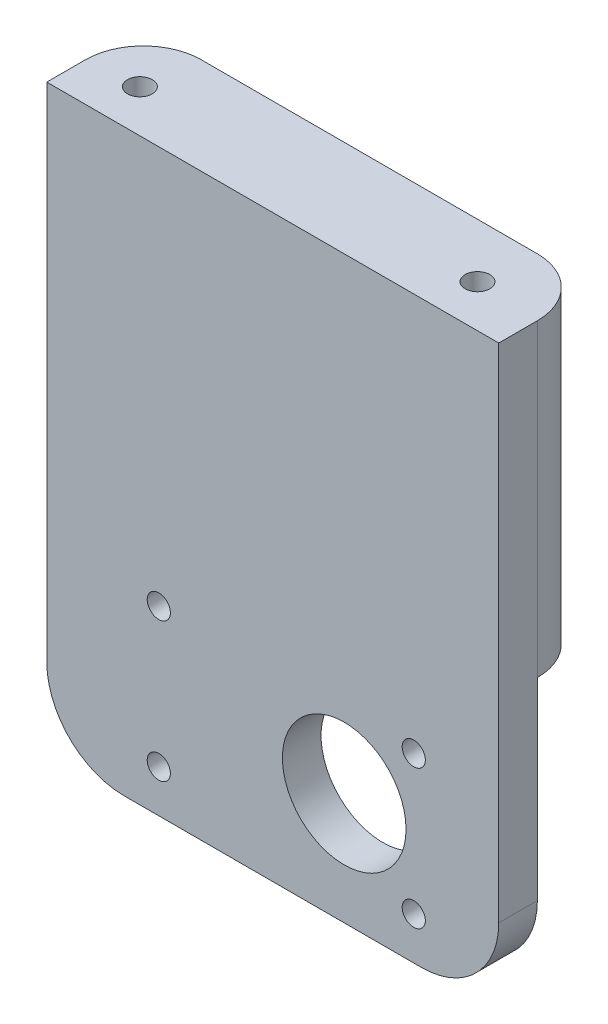
ISO-10303-21;
HEADER;
FILE_DESCRIPTION(('STEP AP214'),'2;1');
FILE_NAME('part.step','',(''),(''),'','','');
FILE_SCHEMA(('AUTOMOTIVE_DESIGN { 1 0 10303 214 1 1 1 1 }'));
ENDSEC;
DATA;
#1=APPLICATION_CONTEXT('core data for automotive mechanical design processes');
#2=APPLICATION_PROTOCOL_DEFINITION('international standard','automotive_design',2000,#1);
#3=PRODUCT_CONTEXT('',#1,'mechanical');
#4=PRODUCT('Part','Part','',(#3));
#5=PRODUCT_RELATED_PRODUCT_CATEGORY('part','',(#4));
#6=PRODUCT_DEFINITION_FORMATION('','',#4);
#7=PRODUCT_DEFINITION_CONTEXT('part definition',#1,'design');
#8=PRODUCT_DEFINITION('design','',#6,#7);
#9=PRODUCT_DEFINITION_SHAPE('','',#8);
#10=(LENGTH_UNIT() NAMED_UNIT(*) SI_UNIT(.MILLI.,.METRE.));
#11=(NAMED_UNIT(*) PLANE_ANGLE_UNIT() SI_UNIT($,.RADIAN.));
#12=(NAMED_UNIT(*) SI_UNIT($,.STERADIAN.) SOLID_ANGLE_UNIT());
#13=UNCERTAINTY_MEASURE_WITH_UNIT(LENGTH_MEASURE(1.E-05),#10,'distance_accuracy_value','');
#14=(GEOMETRIC_REPRESENTATION_CONTEXT(3) GLOBAL_UNCERTAINTY_ASSIGNED_CONTEXT((#13)) GLOBAL_UNIT_ASSIGNED_CONTEXT((#10,
#11,#12)) REPRESENTATION_CONTEXT('',''));
#15=CARTESIAN_POINT('',(0.,0.,0.));
#16=DIRECTION('',(0.,0.,1.));
#17=DIRECTION('',(1.,0.,0.));
#18=AXIS2_PLACEMENT_3D('',#15,#16,#17);
#19=CARTESIAN_POINT('',(0.,0.,-2.5));
#20=DIRECTION('',(0.,0.,1.));
#21=DIRECTION('',(1.,0.,0.));
#22=AXIS2_PLACEMENT_3D('',#19,#20,#21);
#23=PLANE('',#22);
#24=CARTESIAN_POINT('',(0.,0.,-2.5));
#25=DIRECTION('',(0.,0.,1.));
#26=DIRECTION('',(1.,0.,0.));
#27=AXIS2_PLACEMENT_3D('',#24,#25,#26);
#28=CIRCLE('',#27,8.);
#29=CARTESIAN_POINT('',(8.,0.,-2.5));
#30=VERTEX_POINT('',#29);
#31=EDGE_CURVE('E181',#30,#30,#28,.T.);
#32=ORIENTED_EDGE('',*,*,#31,.T.);
#33=EDGE_LOOP('',(#32));
#34=FACE_BOUND('',#33,.T.);
#35=CARTESIAN_POINT('',(-24.,-9.,-2.5));
#36=DIRECTION('',(0.,0.,1.));
#37=DIRECTION('',(1.,0.,0.));
#38=AXIS2_PLACEMENT_3D('',#35,#36,#37);
#39=CIRCLE('',#38,1.5);
#40=CARTESIAN_POINT('',(-22.5,-9.,-2.5));
#41=VERTEX_POINT('',#40);
#42=EDGE_CURVE('E178',#41,#41,#39,.T.);
#43=ORIENTED_EDGE('',*,*,#42,.T.);
#44=EDGE_LOOP('',(#43));
#45=FACE_BOUND('',#44,.T.);
#46=CARTESIAN_POINT('',(9.,-9.,-2.5));
#47=DIRECTION('',(0.,0.,1.));
#48=DIRECTION('',(1.,0.,0.));
#49=AXIS2_PLACEMENT_3D('',#46,#47,#48);
#50=CIRCLE('',#49,1.5);
#51=CARTESIAN_POINT('',(10.5,-9.,-2.5));
#52=VERTEX_POINT('',#51);
#53=EDGE_CURVE('E175',#52,#52,#50,.T.);
#54=ORIENTED_EDGE('',*,*,#53,.T.);
#55=EDGE_LOOP('',(#54));
#56=FACE_BOUND('',#55,.T.);
#57=CARTESIAN_POINT('',(9.,9.,-2.5));
#58=DIRECTION('',(0.,0.,1.));
#59=DIRECTION('',(1.,0.,0.));
#60=AXIS2_PLACEMENT_3D('',#57,#58,#59);
#61=CIRCLE('',#60,1.5);
#62=CARTESIAN_POINT('',(10.5,9.,-2.5));
#63=VERTEX_POINT('',#62);
#64=EDGE_CURVE('E172',#63,#63,#61,.T.);
#65=ORIENTED_EDGE('',*,*,#64,.T.);
#66=EDGE_LOOP('',(#65));
#67=FACE_BOUND('',#66,.T.);
#68=CARTESIAN_POINT('',(-24.,9.,-2.5));
#69=DIRECTION('',(0.,0.,1.));
#70=DIRECTION('',(1.,0.,0.));
#71=AXIS2_PLACEMENT_3D('',#68,#69,#70);
#72=CIRCLE('',#71,1.5);
#73=CARTESIAN_POINT('',(-22.5,9.,-2.5));
#74=VERTEX_POINT('',#73);
#75=EDGE_CURVE('E138',#74,#74,#72,.T.);
#76=ORIENTED_EDGE('',*,*,#75,.T.);
#77=EDGE_LOOP('',(#76));
#78=FACE_BOUND('',#77,.T.);
#79=DIRECTION('',(-1.,0.,0.));
#80=VECTOR('',#79,1.);
#81=CARTESIAN_POINT('',(0.,-14.5,-2.5));
#82=LINE('',#81,#80);
#83=CARTESIAN_POINT('',(10.,-14.5,-2.5));
#84=VERTEX_POINT('',#83);
#85=CARTESIAN_POINT('',(-28.5,-14.5,-2.5));
#86=VERTEX_POINT('',#85);
#87=EDGE_CURVE('E187',#84,#86,#82,.T.);
#88=ORIENTED_EDGE('',*,*,#87,.T.);
#89=CARTESIAN_POINT('',(-28.5,-4.5,-2.5));
#90=DIRECTION('',(0.,0.,1.));
#91=DIRECTION('',(1.,0.,0.));
#92=AXIS2_PLACEMENT_3D('',#89,#90,#91);
#93=CIRCLE('',#92,10.);
#94=CARTESIAN_POINT('',(-38.5,-4.5,-2.5));
#95=VERTEX_POINT('',#94);
#96=EDGE_CURVE('E202',#86,#95,#93,.F.);
#97=ORIENTED_EDGE('',*,*,#96,.T.);
#98=DIRECTION('',(0.,-1.,0.));
#99=VECTOR('',#98,1.);
#100=CARTESIAN_POINT('',(-38.5,0.,-2.5));
#101=LINE('',#100,#99);
#102=CARTESIAN_POINT('',(-38.5,20.5,-2.5));
#103=VERTEX_POINT('',#102);
#104=EDGE_CURVE('E184',#103,#95,#101,.T.);
#105=ORIENTED_EDGE('',*,*,#104,.F.);
#106=DIRECTION('',(-1.,0.,0.));
#107=VECTOR('',#106,1.);
#108=CARTESIAN_POINT('',(-38.5,20.5,-2.5));
#109=LINE('',#108,#107);
#110=CARTESIAN_POINT('',(20.,20.5,-2.5));
#111=VERTEX_POINT('',#110);
#112=EDGE_CURVE('E131',#111,#103,#109,.T.);
#113=ORIENTED_EDGE('',*,*,#112,.F.);
#114=DIRECTION('',(0.,-1.,0.));
#115=VECTOR('',#114,1.);
#116=CARTESIAN_POINT('',(20.,0.,-2.5));
#117=LINE('',#116,#115);
#118=CARTESIAN_POINT('',(20.,-4.5,-2.5));
#119=VERTEX_POINT('',#118);
#120=EDGE_CURVE('E145',#111,#119,#117,.T.);
#121=ORIENTED_EDGE('',*,*,#120,.T.);
#122=CARTESIAN_POINT('',(10.,-4.5,-2.5));
#123=DIRECTION('',(0.,0.,1.));
#124=DIRECTION('',(1.,0.,0.));
#125=AXIS2_PLACEMENT_3D('',#122,#123,#124);
#126=CIRCLE('',#125,10.);
#127=EDGE_CURVE('E200',#119,#84,#126,.F.);
#128=ORIENTED_EDGE('',*,*,#127,.T.);
#129=EDGE_LOOP('',(#88,#97,#105,#113,#121,#128));
#130=FACE_BOUND('',#129,.T.);
#131=ADVANCED_FACE('F35',(#34,#45,#56,#67,#78,#130),#23,.F.);
#132=CARTESIAN_POINT('',(0.,60.5,2.5));
#133=DIRECTION('',(0.,-1.,0.));
#134=DIRECTION('',(1.,0.,0.));
#135=AXIS2_PLACEMENT_3D('',#132,#133,#134);
#136=PLANE('',#135);
#137=CARTESIAN_POINT('',(-31.95,60.5,-3.));
#138=DIRECTION('',(0.,1.,0.));
#139=DIRECTION('',(0.,0.,1.));
#140=AXIS2_PLACEMENT_3D('',#137,#138,#139);
#141=CIRCLE('',#140,1.6);
#142=CARTESIAN_POINT('',(-31.95,60.5,-1.4));
#143=VERTEX_POINT('',#142);
#144=EDGE_CURVE('E121',#143,#143,#141,.T.);
#145=ORIENTED_EDGE('',*,*,#144,.F.);
#146=EDGE_LOOP('',(#145));
#147=FACE_BOUND('',#146,.T.);
#148=CARTESIAN_POINT('',(11.75,60.5,-3.));
#149=DIRECTION('',(0.,1.,0.));
#150=DIRECTION('',(0.,0.,1.));
#151=AXIS2_PLACEMENT_3D('',#148,#149,#150);
#152=CIRCLE('',#151,1.6);
#153=CARTESIAN_POINT('',(11.75,60.5,-1.4));
#154=VERTEX_POINT('',#153);
#155=EDGE_CURVE('E120',#154,#154,#152,.T.);
#156=ORIENTED_EDGE('',*,*,#155,.F.);
#157=EDGE_LOOP('',(#156));
#158=FACE_BOUND('',#157,.T.);
#159=DIRECTION('',(1.,0.,0.));
#160=VECTOR('',#159,1.);
#161=CARTESIAN_POINT('',(-38.5,60.5,-10.));
#162=LINE('',#161,#160);
#163=CARTESIAN_POINT('',(-31.,60.5,-10.));
#164=VERTEX_POINT('',#163);
#165=CARTESIAN_POINT('',(12.5,60.5,-10.));
#166=VERTEX_POINT('',#165);
#167=EDGE_CURVE('E132',#164,#166,#162,.T.);
#168=ORIENTED_EDGE('',*,*,#167,.F.);
#169=CARTESIAN_POINT('',(-31.,60.5,-2.5));
#170=DIRECTION('',(0.,-1.,0.));
#171=DIRECTION('',(1.,0.,0.));
#172=AXIS2_PLACEMENT_3D('',#169,#170,#171);
#173=CIRCLE('',#172,7.5);
#174=CARTESIAN_POINT('',(-38.5,60.5,-2.5));
#175=VERTEX_POINT('',#174);
#176=EDGE_CURVE('E50',#164,#175,#173,.F.);
#177=ORIENTED_EDGE('',*,*,#176,.T.);
#178=DIRECTION('',(0.,0.,-1.));
#179=VECTOR('',#178,1.);
#180=CARTESIAN_POINT('',(-38.5,60.5,2.5));
#181=LINE('',#180,#179);
#182=CARTESIAN_POINT('',(-38.5,60.5,2.5));
#183=VERTEX_POINT('',#182);
#184=EDGE_CURVE('E193',#183,#175,#181,.T.);
#185=ORIENTED_EDGE('',*,*,#184,.F.);
#186=DIRECTION('',(-1.,0.,0.));
#187=VECTOR('',#186,1.);
#188=CARTESIAN_POINT('',(0.,60.5,2.5));
#189=LINE('',#188,#187);
#190=CARTESIAN_POINT('',(20.,60.5,2.5));
#191=VERTEX_POINT('',#190);
#192=EDGE_CURVE('E157',#191,#183,#189,.T.);
#193=ORIENTED_EDGE('',*,*,#192,.F.);
#194=DIRECTION('',(0.,0.,-1.));
#195=VECTOR('',#194,1.);
#196=CARTESIAN_POINT('',(20.,60.5,2.5));
#197=LINE('',#196,#195);
#198=CARTESIAN_POINT('',(20.,60.5,-2.5));
#199=VERTEX_POINT('',#198);
#200=EDGE_CURVE('E169',#191,#199,#197,.T.);
#201=ORIENTED_EDGE('',*,*,#200,.T.);
#202=CARTESIAN_POINT('',(12.5,60.5,-2.5));
#203=DIRECTION('',(0.,-1.,0.));
#204=DIRECTION('',(1.,0.,0.));
#205=AXIS2_PLACEMENT_3D('',#202,#203,#204);
#206=CIRCLE('',#205,7.5);
#207=EDGE_CURVE('E219',#199,#166,#206,.F.);
#208=ORIENTED_EDGE('',*,*,#207,.T.);
#209=EDGE_LOOP('',(#168,#177,#185,#193,#201,#208));
#210=FACE_BOUND('',#209,.T.);
#211=ADVANCED_FACE('F260',(#147,#158,#210),#136,.F.);
#212=CARTESIAN_POINT('',(-38.5,0.,2.5));
#213=DIRECTION('',(1.,0.,0.));
#214=DIRECTION('',(0.,1.,0.));
#215=AXIS2_PLACEMENT_3D('',#212,#213,#214);
#216=PLANE('',#215);
#217=ORIENTED_EDGE('',*,*,#184,.T.);
#218=DIRECTION('',(0.,1.,0.));
#219=VECTOR('',#218,1.);
#220=CARTESIAN_POINT('',(-38.5,0.,-2.5));
#221=LINE('',#220,#219);
#222=EDGE_CURVE('E222',#175,#103,#221,.F.);
#223=ORIENTED_EDGE('',*,*,#222,.T.);
#224=ORIENTED_EDGE('',*,*,#104,.T.);
#225=DIRECTION('',(0.,0.,-1.));
#226=VECTOR('',#225,1.);
#227=CARTESIAN_POINT('',(-38.5,-4.5,2.5));
#228=LINE('',#227,#226);
#229=CARTESIAN_POINT('',(-38.5,-4.5,2.5));
#230=VERTEX_POINT('',#229);
#231=EDGE_CURVE('E204',#95,#230,#228,.F.);
#232=ORIENTED_EDGE('',*,*,#231,.T.);
#233=DIRECTION('',(0.,-1.,0.));
#234=VECTOR('',#233,1.);
#235=CARTESIAN_POINT('',(-38.5,0.,2.5));
#236=LINE('',#235,#234);
#237=EDGE_CURVE('E160',#183,#230,#236,.T.);
#238=ORIENTED_EDGE('',*,*,#237,.F.);
#239=EDGE_LOOP('',(#217,#223,#224,#232,#238));
#240=FACE_BOUND('',#239,.T.);
#241=ADVANCED_FACE('F239',(#240),#216,.F.);
#242=CARTESIAN_POINT('',(0.,-14.5,2.5));
#243=DIRECTION('',(0.,-1.,0.));
#244=DIRECTION('',(1.,0.,0.));
#245=AXIS2_PLACEMENT_3D('',#242,#243,#244);
#246=PLANE('',#245);
#247=DIRECTION('',(-1.,0.,0.));
#248=VECTOR('',#247,1.);
#249=CARTESIAN_POINT('',(0.,-14.5,2.5));
#250=LINE('',#249,#248);
#251=CARTESIAN_POINT('',(10.,-14.5,2.5));
#252=VERTEX_POINT('',#251);
#253=CARTESIAN_POINT('',(-28.5,-14.5,2.5));
#254=VERTEX_POINT('',#253);
#255=EDGE_CURVE('E163',#252,#254,#250,.T.);
#256=ORIENTED_EDGE('',*,*,#255,.T.);
#257=DIRECTION('',(0.,0.,-1.));
#258=VECTOR('',#257,1.);
#259=CARTESIAN_POINT('',(-28.5,-14.5,-2.5));
#260=LINE('',#259,#258);
#261=EDGE_CURVE('E197',#254,#86,#260,.T.);
#262=ORIENTED_EDGE('',*,*,#261,.T.);
#263=ORIENTED_EDGE('',*,*,#87,.F.);
#264=DIRECTION('',(0.,0.,-1.));
#265=VECTOR('',#264,1.);
#266=CARTESIAN_POINT('',(10.,-14.5,2.5));
#267=LINE('',#266,#265);
#268=EDGE_CURVE('E195',#84,#252,#267,.F.);
#269=ORIENTED_EDGE('',*,*,#268,.T.);
#270=EDGE_LOOP('',(#256,#262,#263,#269));
#271=FACE_BOUND('',#270,.T.);
#272=ADVANCED_FACE('F248',(#271),#246,.T.);
#273=CARTESIAN_POINT('',(0.,0.,2.5));
#274=DIRECTION('',(0.,0.,-1.));
#275=DIRECTION('',(-1.,0.,0.));
#276=AXIS2_PLACEMENT_3D('',#273,#274,#275);
#277=CYLINDRICAL_SURFACE('',#276,8.);
#278=CARTESIAN_POINT('',(0.,0.,2.5));
#279=DIRECTION('',(0.,0.,1.));
#280=DIRECTION('',(1.,0.,0.));
#281=AXIS2_PLACEMENT_3D('',#278,#279,#280);
#282=CIRCLE('',#281,8.);
#283=CARTESIAN_POINT('',(8.,0.,2.5));
#284=VERTEX_POINT('',#283);
#285=EDGE_CURVE('E154',#284,#284,#282,.T.);
#286=ORIENTED_EDGE('',*,*,#285,.T.);
#287=EDGE_LOOP('',(#286));
#288=FACE_BOUND('',#287,.T.);
#289=ORIENTED_EDGE('',*,*,#31,.F.);
#290=EDGE_LOOP('',(#289));
#291=FACE_BOUND('',#290,.T.);
#292=ADVANCED_FACE('F275',(#288,#291),#277,.F.);
#293=CARTESIAN_POINT('',(-24.,-9.,2.5));
#294=DIRECTION('',(0.,0.,-1.));
#295=DIRECTION('',(-1.,0.,0.));
#296=AXIS2_PLACEMENT_3D('',#293,#294,#295);
#297=CYLINDRICAL_SURFACE('',#296,1.5);
#298=CARTESIAN_POINT('',(-24.,-9.,2.5));
#299=DIRECTION('',(0.,0.,1.));
#300=DIRECTION('',(1.,0.,0.));
#301=AXIS2_PLACEMENT_3D('',#298,#299,#300);
#302=CIRCLE('',#301,1.5);
#303=CARTESIAN_POINT('',(-22.5,-9.,2.5));
#304=VERTEX_POINT('',#303);
#305=EDGE_CURVE('E151',#304,#304,#302,.T.);
#306=ORIENTED_EDGE('',*,*,#305,.T.);
#307=EDGE_LOOP('',(#306));
#308=FACE_BOUND('',#307,.T.);
#309=ORIENTED_EDGE('',*,*,#42,.F.);
#310=EDGE_LOOP('',(#309));
#311=FACE_BOUND('',#310,.T.);
#312=ADVANCED_FACE('F278',(#308,#311),#297,.F.);
#313=CARTESIAN_POINT('',(9.,-9.,2.5));
#314=DIRECTION('',(0.,0.,-1.));
#315=DIRECTION('',(-1.,0.,0.));
#316=AXIS2_PLACEMENT_3D('',#313,#314,#315);
#317=CYLINDRICAL_SURFACE('',#316,1.5);
#318=CARTESIAN_POINT('',(9.,-9.,2.5));
#319=DIRECTION('',(0.,0.,1.));
#320=DIRECTION('',(1.,0.,0.));
#321=AXIS2_PLACEMENT_3D('',#318,#319,#320);
#322=CIRCLE('',#321,1.5);
#323=CARTESIAN_POINT('',(10.5,-9.,2.5));
#324=VERTEX_POINT('',#323);
#325=EDGE_CURVE('E148',#324,#324,#322,.T.);
#326=ORIENTED_EDGE('',*,*,#325,.T.);
#327=EDGE_LOOP('',(#326));
#328=FACE_BOUND('',#327,.T.);
#329=ORIENTED_EDGE('',*,*,#53,.F.);
#330=EDGE_LOOP('',(#329));
#331=FACE_BOUND('',#330,.T.);
#332=ADVANCED_FACE('F282',(#328,#331),#317,.F.);
#333=CARTESIAN_POINT('',(9.,9.,2.5));
#334=DIRECTION('',(0.,0.,-1.));
#335=DIRECTION('',(-1.,0.,0.));
#336=AXIS2_PLACEMENT_3D('',#333,#334,#335);
#337=CYLINDRICAL_SURFACE('',#336,1.5);
#338=CARTESIAN_POINT('',(9.,9.,2.5));
#339=DIRECTION('',(0.,0.,1.));
#340=DIRECTION('',(1.,0.,0.));
#341=AXIS2_PLACEMENT_3D('',#338,#339,#340);
#342=CIRCLE('',#341,1.5);
#343=CARTESIAN_POINT('',(10.5,9.,2.5));
#344=VERTEX_POINT('',#343);
#345=EDGE_CURVE('E144',#344,#344,#342,.T.);
#346=ORIENTED_EDGE('',*,*,#345,.T.);
#347=EDGE_LOOP('',(#346));
#348=FACE_BOUND('',#347,.T.);
#349=ORIENTED_EDGE('',*,*,#64,.F.);
#350=EDGE_LOOP('',(#349));
#351=FACE_BOUND('',#350,.T.);
#352=ADVANCED_FACE('F286',(#348,#351),#337,.F.);
#353=CARTESIAN_POINT('',(-24.,9.,2.5));
#354=DIRECTION('',(0.,0.,-1.));
#355=DIRECTION('',(-1.,0.,0.));
#356=AXIS2_PLACEMENT_3D('',#353,#354,#355);
#357=CYLINDRICAL_SURFACE('',#356,1.5);
#358=CARTESIAN_POINT('',(-24.,9.,2.5));
#359=DIRECTION('',(0.,0.,1.));
#360=DIRECTION('',(1.,0.,0.));
#361=AXIS2_PLACEMENT_3D('',#358,#359,#360);
#362=CIRCLE('',#361,1.5);
#363=CARTESIAN_POINT('',(-22.5,9.,2.5));
#364=VERTEX_POINT('',#363);
#365=EDGE_CURVE('E141',#364,#364,#362,.T.);
#366=ORIENTED_EDGE('',*,*,#365,.T.);
#367=EDGE_LOOP('',(#366));
#368=FACE_BOUND('',#367,.T.);
#369=ORIENTED_EDGE('',*,*,#75,.F.);
#370=EDGE_LOOP('',(#369));
#371=FACE_BOUND('',#370,.T.);
#372=ADVANCED_FACE('F290',(#368,#371),#357,.F.);
#373=CARTESIAN_POINT('',(20.,0.,2.5));
#374=DIRECTION('',(1.,0.,0.));
#375=DIRECTION('',(0.,1.,0.));
#376=AXIS2_PLACEMENT_3D('',#373,#374,#375);
#377=PLANE('',#376);
#378=ORIENTED_EDGE('',*,*,#120,.F.);
#379=DIRECTION('',(0.,-1.,0.));
#380=VECTOR('',#379,1.);
#381=CARTESIAN_POINT('',(20.,60.5,-2.5));
#382=LINE('',#381,#380);
#383=EDGE_CURVE('E11',#111,#199,#382,.F.);
#384=ORIENTED_EDGE('',*,*,#383,.T.);
#385=ORIENTED_EDGE('',*,*,#200,.F.);
#386=DIRECTION('',(0.,-1.,0.));
#387=VECTOR('',#386,1.);
#388=CARTESIAN_POINT('',(20.,0.,2.5));
#389=LINE('',#388,#387);
#390=CARTESIAN_POINT('',(20.,-4.5,2.5));
#391=VERTEX_POINT('',#390);
#392=EDGE_CURVE('E166',#191,#391,#389,.T.);
#393=ORIENTED_EDGE('',*,*,#392,.T.);
#394=DIRECTION('',(0.,0.,-1.));
#395=VECTOR('',#394,1.);
#396=CARTESIAN_POINT('',(20.,-4.5,2.5));
#397=LINE('',#396,#395);
#398=EDGE_CURVE('E210',#391,#119,#397,.T.);
#399=ORIENTED_EDGE('',*,*,#398,.T.);
#400=EDGE_LOOP('',(#378,#384,#385,#393,#399));
#401=FACE_BOUND('',#400,.T.);
#402=ADVANCED_FACE('F258',(#401),#377,.T.);
#403=CARTESIAN_POINT('',(0.,0.,2.5));
#404=DIRECTION('',(0.,0.,1.));
#405=DIRECTION('',(1.,0.,0.));
#406=AXIS2_PLACEMENT_3D('',#403,#404,#405);
#407=PLANE('',#406);
#408=ORIENTED_EDGE('',*,*,#365,.F.);
#409=EDGE_LOOP('',(#408));
#410=FACE_BOUND('',#409,.T.);
#411=ORIENTED_EDGE('',*,*,#345,.F.);
#412=EDGE_LOOP('',(#411));
#413=FACE_BOUND('',#412,.T.);
#414=ORIENTED_EDGE('',*,*,#325,.F.);
#415=EDGE_LOOP('',(#414));
#416=FACE_BOUND('',#415,.T.);
#417=ORIENTED_EDGE('',*,*,#305,.F.);
#418=EDGE_LOOP('',(#417));
#419=FACE_BOUND('',#418,.T.);
#420=ORIENTED_EDGE('',*,*,#285,.F.);
#421=EDGE_LOOP('',(#420));
#422=FACE_BOUND('',#421,.T.);
#423=ORIENTED_EDGE('',*,*,#237,.T.);
#424=CARTESIAN_POINT('',(-28.5,-4.5,2.5));
#425=DIRECTION('',(0.,0.,1.));
#426=DIRECTION('',(1.,0.,0.));
#427=AXIS2_PLACEMENT_3D('',#424,#425,#426);
#428=CIRCLE('',#427,10.);
#429=EDGE_CURVE('E208',#230,#254,#428,.T.);
#430=ORIENTED_EDGE('',*,*,#429,.T.);
#431=ORIENTED_EDGE('',*,*,#255,.F.);
#432=CARTESIAN_POINT('',(10.,-4.5,2.5));
#433=DIRECTION('',(0.,0.,1.));
#434=DIRECTION('',(1.,0.,0.));
#435=AXIS2_PLACEMENT_3D('',#432,#433,#434);
#436=CIRCLE('',#435,10.);
#437=EDGE_CURVE('E206',#252,#391,#436,.T.);
#438=ORIENTED_EDGE('',*,*,#437,.T.);
#439=ORIENTED_EDGE('',*,*,#392,.F.);
#440=ORIENTED_EDGE('',*,*,#192,.T.);
#441=EDGE_LOOP('',(#423,#430,#431,#438,#439,#440));
#442=FACE_BOUND('',#441,.T.);
#443=ADVANCED_FACE('F253',(#410,#413,#416,#419,#422,#442),#407,.T.);
#444=CARTESIAN_POINT('',(-38.5,20.5,-10.));
#445=DIRECTION('',(0.,1.,0.));
#446=DIRECTION('',(-1.,0.,0.));
#447=AXIS2_PLACEMENT_3D('',#444,#445,#446);
#448=PLANE('',#447);
#449=ORIENTED_EDGE('',*,*,#112,.T.);
#450=CARTESIAN_POINT('',(-31.,20.5,-2.5));
#451=DIRECTION('',(0.,1.,0.));
#452=DIRECTION('',(-1.,0.,0.));
#453=AXIS2_PLACEMENT_3D('',#450,#451,#452);
#454=CIRCLE('',#453,7.5);
#455=CARTESIAN_POINT('',(-31.,20.5,-10.));
#456=VERTEX_POINT('',#455);
#457=EDGE_CURVE('E43',#103,#456,#454,.F.);
#458=ORIENTED_EDGE('',*,*,#457,.T.);
#459=DIRECTION('',(-1.,0.,0.));
#460=VECTOR('',#459,1.);
#461=CARTESIAN_POINT('',(-38.5,20.5,-10.));
#462=LINE('',#461,#460);
#463=CARTESIAN_POINT('',(12.5,20.5,-10.));
#464=VERTEX_POINT('',#463);
#465=EDGE_CURVE('E135',#464,#456,#462,.T.);
#466=ORIENTED_EDGE('',*,*,#465,.F.);
#467=CARTESIAN_POINT('',(12.5,20.5,-2.5));
#468=DIRECTION('',(0.,1.,0.));
#469=DIRECTION('',(-1.,0.,0.));
#470=AXIS2_PLACEMENT_3D('',#467,#468,#469);
#471=CIRCLE('',#470,7.5);
#472=EDGE_CURVE('E224',#464,#111,#471,.F.);
#473=ORIENTED_EDGE('',*,*,#472,.T.);
#474=EDGE_LOOP('',(#449,#458,#466,#473));
#475=FACE_BOUND('',#474,.T.);
#476=ADVANCED_FACE('F228',(#475),#448,.F.);
#477=CARTESIAN_POINT('',(0.,0.,-10.));
#478=DIRECTION('',(0.,0.,1.));
#479=DIRECTION('',(1.,0.,0.));
#480=AXIS2_PLACEMENT_3D('',#477,#478,#479);
#481=PLANE('',#480);
#482=ORIENTED_EDGE('',*,*,#465,.T.);
#483=DIRECTION('',(0.,1.,0.));
#484=VECTOR('',#483,1.);
#485=CARTESIAN_POINT('',(-31.,0.,-10.));
#486=LINE('',#485,#484);
#487=EDGE_CURVE('E216',#456,#164,#486,.T.);
#488=ORIENTED_EDGE('',*,*,#487,.T.);
#489=ORIENTED_EDGE('',*,*,#167,.T.);
#490=DIRECTION('',(0.,-1.,0.));
#491=VECTOR('',#490,1.);
#492=CARTESIAN_POINT('',(12.5,20.5,-10.));
#493=LINE('',#492,#491);
#494=EDGE_CURVE('E213',#166,#464,#493,.T.);
#495=ORIENTED_EDGE('',*,*,#494,.T.);
#496=EDGE_LOOP('',(#482,#488,#489,#495));
#497=FACE_BOUND('',#496,.T.);
#498=ADVANCED_FACE('F234',(#497),#481,.F.);
#499=CARTESIAN_POINT('',(11.75,56.5,-3.));
#500=DIRECTION('',(0.,1.,0.));
#501=DIRECTION('',(0.,0.,1.));
#502=AXIS2_PLACEMENT_3D('',#499,#500,#501);
#503=CONICAL_SURFACE('',#502,1.6,1.02974425867665);
#504=CARTESIAN_POINT('',(11.75,55.5386230095559,-3.));
#505=VERTEX_POINT('',#504);
#506=VERTEX_LOOP('',#505);
#507=FACE_BOUND('',#506,.T.);
#508=CARTESIAN_POINT('',(11.75,56.5,-3.));
#509=DIRECTION('',(0.,1.,0.));
#510=DIRECTION('',(0.,0.,1.));
#511=AXIS2_PLACEMENT_3D('',#508,#509,#510);
#512=CIRCLE('',#511,1.6);
#513=CARTESIAN_POINT('',(11.75,56.5,-1.4));
#514=VERTEX_POINT('',#513);
#515=EDGE_CURVE('E124',#514,#514,#512,.T.);
#516=ORIENTED_EDGE('',*,*,#515,.T.);
#517=EDGE_LOOP('',(#516));
#518=FACE_BOUND('',#517,.T.);
#519=ADVANCED_FACE('F320',(#507,#518),#503,.F.);
#520=CARTESIAN_POINT('',(11.75,60.5,-3.));
#521=DIRECTION('',(0.,1.,0.));
#522=DIRECTION('',(0.,0.,1.));
#523=AXIS2_PLACEMENT_3D('',#520,#521,#522);
#524=CYLINDRICAL_SURFACE('',#523,1.6);
#525=ORIENTED_EDGE('',*,*,#515,.F.);
#526=EDGE_LOOP('',(#525));
#527=FACE_BOUND('',#526,.T.);
#528=ORIENTED_EDGE('',*,*,#155,.T.);
#529=EDGE_LOOP('',(#528));
#530=FACE_BOUND('',#529,.T.);
#531=ADVANCED_FACE('F114',(#527,#530),#524,.F.);
#532=CARTESIAN_POINT('',(-31.95,56.5,-3.));
#533=DIRECTION('',(0.,1.,0.));
#534=DIRECTION('',(0.,0.,1.));
#535=AXIS2_PLACEMENT_3D('',#532,#533,#534);
#536=CONICAL_SURFACE('',#535,1.6,1.02974425867665);
#537=CARTESIAN_POINT('',(-31.95,55.5386230095559,-3.));
#538=VERTEX_POINT('',#537);
#539=VERTEX_LOOP('',#538);
#540=FACE_BOUND('',#539,.T.);
#541=CARTESIAN_POINT('',(-31.95,56.5,-3.));
#542=DIRECTION('',(0.,1.,0.));
#543=DIRECTION('',(0.,0.,1.));
#544=AXIS2_PLACEMENT_3D('',#541,#542,#543);
#545=CIRCLE('',#544,1.6);
#546=CARTESIAN_POINT('',(-31.95,56.5,-1.4));
#547=VERTEX_POINT('',#546);
#548=EDGE_CURVE('E118',#547,#547,#545,.T.);
#549=ORIENTED_EDGE('',*,*,#548,.T.);
#550=EDGE_LOOP('',(#549));
#551=FACE_BOUND('',#550,.T.);
#552=ADVANCED_FACE('F110',(#540,#551),#536,.F.);
#553=CARTESIAN_POINT('',(-31.95,60.5,-3.));
#554=DIRECTION('',(0.,1.,0.));
#555=DIRECTION('',(0.,0.,1.));
#556=AXIS2_PLACEMENT_3D('',#553,#554,#555);
#557=CYLINDRICAL_SURFACE('',#556,1.6);
#558=ORIENTED_EDGE('',*,*,#548,.F.);
#559=EDGE_LOOP('',(#558));
#560=FACE_BOUND('',#559,.T.);
#561=ORIENTED_EDGE('',*,*,#144,.T.);
#562=EDGE_LOOP('',(#561));
#563=FACE_BOUND('',#562,.T.);
#564=ADVANCED_FACE('F113',(#560,#563),#557,.F.);
#565=CARTESIAN_POINT('',(-28.5,-4.5,2.5));
#566=DIRECTION('',(0.,0.,1.));
#567=DIRECTION('',(1.,0.,0.));
#568=AXIS2_PLACEMENT_3D('',#565,#566,#567);
#569=CYLINDRICAL_SURFACE('',#568,10.);
#570=ORIENTED_EDGE('',*,*,#429,.F.);
#571=ORIENTED_EDGE('',*,*,#231,.F.);
#572=ORIENTED_EDGE('',*,*,#96,.F.);
#573=ORIENTED_EDGE('',*,*,#261,.F.);
#574=EDGE_LOOP('',(#570,#571,#572,#573));
#575=FACE_BOUND('',#574,.T.);
#576=ADVANCED_FACE('F246',(#575),#569,.T.);
#577=CARTESIAN_POINT('',(10.,-4.5,2.5));
#578=DIRECTION('',(0.,0.,-1.));
#579=DIRECTION('',(-1.,0.,0.));
#580=AXIS2_PLACEMENT_3D('',#577,#578,#579);
#581=CYLINDRICAL_SURFACE('',#580,10.);
#582=ORIENTED_EDGE('',*,*,#437,.F.);
#583=ORIENTED_EDGE('',*,*,#268,.F.);
#584=ORIENTED_EDGE('',*,*,#127,.F.);
#585=ORIENTED_EDGE('',*,*,#398,.F.);
#586=EDGE_LOOP('',(#582,#583,#584,#585));
#587=FACE_BOUND('',#586,.T.);
#588=ADVANCED_FACE('F257',(#587),#581,.T.);
#589=CARTESIAN_POINT('',(-31.,0.,-2.5));
#590=DIRECTION('',(0.,1.,0.));
#591=DIRECTION('',(-1.,0.,0.));
#592=AXIS2_PLACEMENT_3D('',#589,#590,#591);
#593=CYLINDRICAL_SURFACE('',#592,7.5);
#594=ORIENTED_EDGE('',*,*,#457,.F.);
#595=ORIENTED_EDGE('',*,*,#222,.F.);
#596=ORIENTED_EDGE('',*,*,#176,.F.);
#597=ORIENTED_EDGE('',*,*,#487,.F.);
#598=EDGE_LOOP('',(#594,#595,#596,#597));
#599=FACE_BOUND('',#598,.T.);
#600=ADVANCED_FACE('F236',(#599),#593,.T.);
#601=CARTESIAN_POINT('',(12.5,0.,-2.5));
#602=DIRECTION('',(0.,1.,0.));
#603=DIRECTION('',(-1.,0.,0.));
#604=AXIS2_PLACEMENT_3D('',#601,#602,#603);
#605=CYLINDRICAL_SURFACE('',#604,7.5);
#606=ORIENTED_EDGE('',*,*,#207,.F.);
#607=ORIENTED_EDGE('',*,*,#383,.F.);
#608=ORIENTED_EDGE('',*,*,#472,.F.);
#609=ORIENTED_EDGE('',*,*,#494,.F.);
#610=EDGE_LOOP('',(#606,#607,#608,#609));
#611=FACE_BOUND('',#610,.T.);
#612=ADVANCED_FACE('F37',(#611),#605,.T.);
#613=CLOSED_SHELL('',(#131,#211,#241,#272,#292,#312,#332,#352,#372,#402,#443,#476,#498,#519,
#531,#552,#564,#576,#588,#600,#612));
#614=MANIFOLD_SOLID_BREP('B2',#613);
#615=ADVANCED_BREP_SHAPE_REPRESENTATION('',(#18,#614),#14);
#616=SHAPE_DEFINITION_REPRESENTATION(#9,#615);
ENDSEC;
END-ISO-10303-21;
